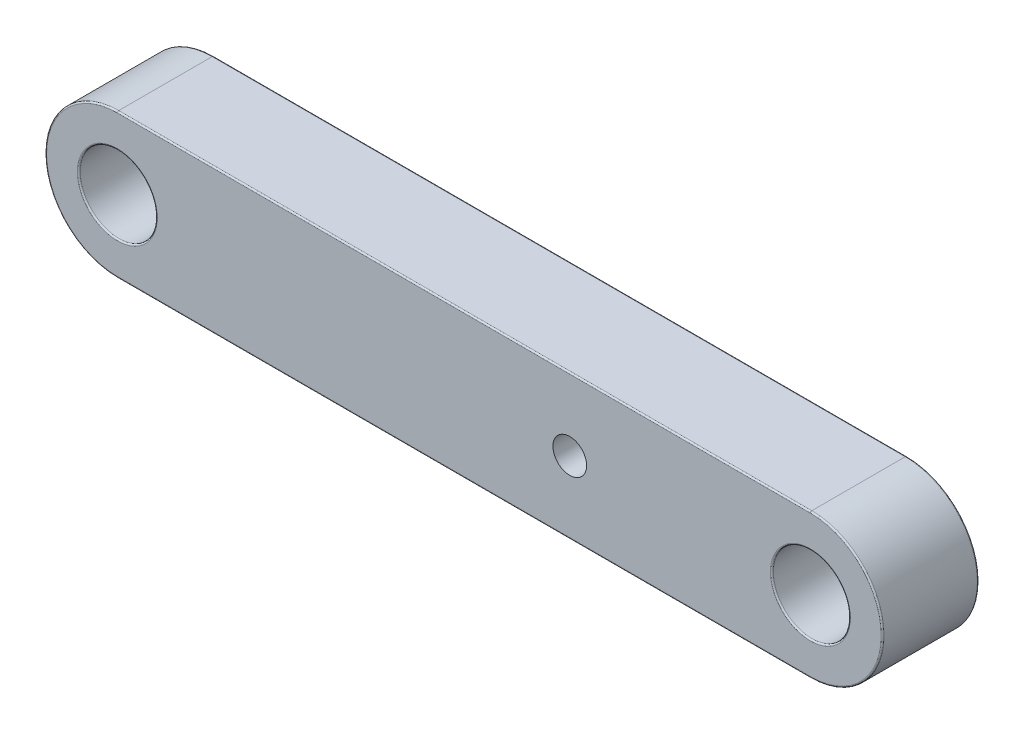
ISO-10303-21;
HEADER;
FILE_DESCRIPTION(('STEP AP214'),'2;1');
FILE_NAME('part.step','',(''),(''),'','','');
FILE_SCHEMA(('AUTOMOTIVE_DESIGN { 1 0 10303 214 1 1 1 1 }'));
ENDSEC;
DATA;
#1=APPLICATION_CONTEXT('core data for automotive mechanical design processes');
#2=APPLICATION_PROTOCOL_DEFINITION('international standard','automotive_design',2000,#1);
#3=PRODUCT_CONTEXT('',#1,'mechanical');
#4=PRODUCT('Part','Part','',(#3));
#5=PRODUCT_RELATED_PRODUCT_CATEGORY('part','',(#4));
#6=PRODUCT_DEFINITION_FORMATION('','',#4);
#7=PRODUCT_DEFINITION_CONTEXT('part definition',#1,'design');
#8=PRODUCT_DEFINITION('design','',#6,#7);
#9=PRODUCT_DEFINITION_SHAPE('','',#8);
#10=(LENGTH_UNIT() NAMED_UNIT(*) SI_UNIT(.MILLI.,.METRE.));
#11=(NAMED_UNIT(*) PLANE_ANGLE_UNIT() SI_UNIT($,.RADIAN.));
#12=(NAMED_UNIT(*) SI_UNIT($,.STERADIAN.) SOLID_ANGLE_UNIT());
#13=UNCERTAINTY_MEASURE_WITH_UNIT(LENGTH_MEASURE(1.E-05),#10,'distance_accuracy_value','');
#14=(GEOMETRIC_REPRESENTATION_CONTEXT(3) GLOBAL_UNCERTAINTY_ASSIGNED_CONTEXT((#13)) GLOBAL_UNIT_ASSIGNED_CONTEXT((#10,
#11,#12)) REPRESENTATION_CONTEXT('',''));
#15=CARTESIAN_POINT('',(0.,0.,0.));
#16=DIRECTION('',(0.,0.,1.));
#17=DIRECTION('',(1.,0.,0.));
#18=AXIS2_PLACEMENT_3D('',#15,#16,#17);
#19=CARTESIAN_POINT('',(36.,0.,5.));
#20=DIRECTION('',(0.,0.,1.));
#21=DIRECTION('',(1.,0.,0.));
#22=AXIS2_PLACEMENT_3D('',#19,#20,#21);
#23=PLANE('',#22);
#24=CARTESIAN_POINT('',(11.,0.000299999999999276,5.));
#25=DIRECTION('',(0.,0.,-1.));
#26=DIRECTION('',(-1.,0.,0.));
#27=AXIS2_PLACEMENT_3D('',#24,#25,#26);
#28=CIRCLE('',#27,1.75);
#29=CARTESIAN_POINT('',(9.25,0.000299999999999276,5.));
#30=VERTEX_POINT('',#29);
#31=EDGE_CURVE('E182',#30,#30,#28,.T.);
#32=ORIENTED_EDGE('',*,*,#31,.T.);
#33=EDGE_LOOP('',(#32));
#34=FACE_BOUND('',#33,.T.);
#35=CARTESIAN_POINT('',(36.,0.,5.));
#36=DIRECTION('',(0.,0.,1.));
#37=DIRECTION('',(1.,0.,0.));
#38=AXIS2_PLACEMENT_3D('',#35,#36,#37);
#39=CIRCLE('',#38,4.15);
#40=CARTESIAN_POINT('',(40.15,0.,5.));
#41=VERTEX_POINT('',#40);
#42=EDGE_CURVE('E11',#41,#41,#39,.F.);
#43=ORIENTED_EDGE('',*,*,#42,.T.);
#44=EDGE_LOOP('',(#43));
#45=FACE_BOUND('',#44,.T.);
#46=CARTESIAN_POINT('',(-36.,0.,5.));
#47=DIRECTION('',(0.,0.,1.));
#48=DIRECTION('',(1.,0.,0.));
#49=AXIS2_PLACEMENT_3D('',#46,#47,#48);
#50=CIRCLE('',#49,7.35000000000009);
#51=CARTESIAN_POINT('',(-35.9999988682833,7.35,5.));
#52=VERTEX_POINT('',#51);
#53=CARTESIAN_POINT('',(-35.9999988452009,-7.35,5.));
#54=VERTEX_POINT('',#53);
#55=EDGE_CURVE('E75',#52,#54,#50,.T.);
#56=ORIENTED_EDGE('',*,*,#55,.T.);
#57=DIRECTION('',(1.,0.,0.));
#58=VECTOR('',#57,1.);
#59=CARTESIAN_POINT('',(35.9999988451871,-7.35,5.));
#60=LINE('',#59,#58);
#61=CARTESIAN_POINT('',(35.9999988451871,-7.35,5.));
#62=VERTEX_POINT('',#61);
#63=EDGE_CURVE('E59',#54,#62,#60,.T.);
#64=ORIENTED_EDGE('',*,*,#63,.T.);
#65=CARTESIAN_POINT('',(36.,0.,5.));
#66=DIRECTION('',(0.,0.,1.));
#67=DIRECTION('',(1.,0.,0.));
#68=AXIS2_PLACEMENT_3D('',#65,#66,#67);
#69=CIRCLE('',#68,7.35000000000009);
#70=CARTESIAN_POINT('',(35.9999988452009,7.35,5.));
#71=VERTEX_POINT('',#70);
#72=EDGE_CURVE('E281',#62,#71,#69,.T.);
#73=ORIENTED_EDGE('',*,*,#72,.T.);
#74=DIRECTION('',(-1.,0.,0.));
#75=VECTOR('',#74,1.);
#76=CARTESIAN_POINT('',(-35.999998845187,7.35,5.));
#77=LINE('',#76,#75);
#78=EDGE_CURVE('E284',#71,#52,#77,.T.);
#79=ORIENTED_EDGE('',*,*,#78,.T.);
#80=EDGE_LOOP('',(#56,#64,#73,#79));
#81=FACE_BOUND('',#80,.T.);
#82=CARTESIAN_POINT('',(-36.,0.,5.));
#83=DIRECTION('',(0.,0.,1.));
#84=DIRECTION('',(1.,0.,0.));
#85=AXIS2_PLACEMENT_3D('',#82,#83,#84);
#86=CIRCLE('',#85,4.15);
#87=CARTESIAN_POINT('',(-31.85,0.,5.));
#88=VERTEX_POINT('',#87);
#89=EDGE_CURVE('E277',#88,#88,#86,.F.);
#90=ORIENTED_EDGE('',*,*,#89,.T.);
#91=EDGE_LOOP('',(#90));
#92=FACE_BOUND('',#91,.T.);
#93=ADVANCED_FACE('F49',(#34,#45,#81,#92),#23,.T.);
#94=CARTESIAN_POINT('',(36.,0.,-5.));
#95=DIRECTION('',(0.,0.,1.));
#96=DIRECTION('',(1.,0.,0.));
#97=AXIS2_PLACEMENT_3D('',#94,#95,#96);
#98=PLANE('',#97);
#99=DIRECTION('',(-1.,0.,0.));
#100=VECTOR('',#99,1.);
#101=CARTESIAN_POINT('',(16.,-3.9994,-5.));
#102=LINE('',#101,#100);
#103=CARTESIAN_POINT('',(16.,-3.9994,-5.));
#104=VERTEX_POINT('',#103);
#105=CARTESIAN_POINT('',(6.,-3.9994,-5.));
#106=VERTEX_POINT('',#105);
#107=EDGE_CURVE('E181',#104,#106,#102,.T.);
#108=ORIENTED_EDGE('',*,*,#107,.F.);
#109=DIRECTION('',(0.,-1.,0.));
#110=VECTOR('',#109,1.);
#111=CARTESIAN_POINT('',(16.,4.,-5.));
#112=LINE('',#111,#110);
#113=CARTESIAN_POINT('',(16.,4.,-5.));
#114=VERTEX_POINT('',#113);
#115=EDGE_CURVE('E67',#114,#104,#112,.T.);
#116=ORIENTED_EDGE('',*,*,#115,.F.);
#117=DIRECTION('',(1.,0.,0.));
#118=VECTOR('',#117,1.);
#119=CARTESIAN_POINT('',(16.,4.,-5.));
#120=LINE('',#119,#118);
#121=CARTESIAN_POINT('',(6.,4.,-5.));
#122=VERTEX_POINT('',#121);
#123=EDGE_CURVE('E165',#122,#114,#120,.T.);
#124=ORIENTED_EDGE('',*,*,#123,.F.);
#125=DIRECTION('',(0.,1.,0.));
#126=VECTOR('',#125,1.);
#127=CARTESIAN_POINT('',(6.,4.,-5.));
#128=LINE('',#127,#126);
#129=EDGE_CURVE('E169',#106,#122,#128,.T.);
#130=ORIENTED_EDGE('',*,*,#129,.F.);
#131=EDGE_LOOP('',(#108,#116,#124,#130));
#132=FACE_BOUND('',#131,.T.);
#133=CARTESIAN_POINT('',(36.,0.,-5.));
#134=DIRECTION('',(0.,0.,1.));
#135=DIRECTION('',(1.,0.,0.));
#136=AXIS2_PLACEMENT_3D('',#133,#134,#135);
#137=CIRCLE('',#136,4.15);
#138=CARTESIAN_POINT('',(40.15,0.,-5.));
#139=VERTEX_POINT('',#138);
#140=EDGE_CURVE('E231',#139,#139,#137,.T.);
#141=ORIENTED_EDGE('',*,*,#140,.T.);
#142=EDGE_LOOP('',(#141));
#143=FACE_BOUND('',#142,.T.);
#144=CARTESIAN_POINT('',(-36.,0.,-5.));
#145=DIRECTION('',(0.,0.,1.));
#146=DIRECTION('',(1.,0.,0.));
#147=AXIS2_PLACEMENT_3D('',#144,#145,#146);
#148=CIRCLE('',#147,4.15);
#149=CARTESIAN_POINT('',(-31.85,0.,-5.));
#150=VERTEX_POINT('',#149);
#151=EDGE_CURVE('E227',#150,#150,#148,.T.);
#152=ORIENTED_EDGE('',*,*,#151,.T.);
#153=EDGE_LOOP('',(#152));
#154=FACE_BOUND('',#153,.T.);
#155=CARTESIAN_POINT('',(-36.,0.,-5.));
#156=DIRECTION('',(0.,0.,1.));
#157=DIRECTION('',(1.,0.,0.));
#158=AXIS2_PLACEMENT_3D('',#155,#156,#157);
#159=CIRCLE('',#158,7.35000000000009);
#160=CARTESIAN_POINT('',(-35.9999988682969,-7.35,-5.));
#161=VERTEX_POINT('',#160);
#162=CARTESIAN_POINT('',(-35.9999988451871,7.35,-5.));
#163=VERTEX_POINT('',#162);
#164=EDGE_CURVE('E220',#161,#163,#159,.F.);
#165=ORIENTED_EDGE('',*,*,#164,.T.);
#166=DIRECTION('',(-1.,0.,0.));
#167=VECTOR('',#166,1.);
#168=CARTESIAN_POINT('',(36.,7.35,-5.));
#169=LINE('',#168,#167);
#170=CARTESIAN_POINT('',(35.9999988452009,7.35,-5.));
#171=VERTEX_POINT('',#170);
#172=EDGE_CURVE('E223',#163,#171,#169,.F.);
#173=ORIENTED_EDGE('',*,*,#172,.T.);
#174=CARTESIAN_POINT('',(36.,0.,-5.));
#175=DIRECTION('',(0.,0.,1.));
#176=DIRECTION('',(1.,0.,0.));
#177=AXIS2_PLACEMENT_3D('',#174,#175,#176);
#178=CIRCLE('',#177,7.35000000000009);
#179=CARTESIAN_POINT('',(35.9999988451871,-7.35,-5.));
#180=VERTEX_POINT('',#179);
#181=EDGE_CURVE('E214',#171,#180,#178,.F.);
#182=ORIENTED_EDGE('',*,*,#181,.T.);
#183=DIRECTION('',(1.,0.,0.));
#184=VECTOR('',#183,1.);
#185=CARTESIAN_POINT('',(36.,-7.35,-5.));
#186=LINE('',#185,#184);
#187=EDGE_CURVE('E217',#180,#161,#186,.F.);
#188=ORIENTED_EDGE('',*,*,#187,.T.);
#189=EDGE_LOOP('',(#165,#173,#182,#188));
#190=FACE_BOUND('',#189,.T.);
#191=ADVANCED_FACE('F359',(#132,#143,#154,#190),#98,.F.);
#192=CARTESIAN_POINT('',(36.,0.,5.));
#193=DIRECTION('',(0.,0.,-1.));
#194=DIRECTION('',(-1.,0.,0.));
#195=AXIS2_PLACEMENT_3D('',#192,#193,#194);
#196=CYLINDRICAL_SURFACE('',#195,7.50000000000009);
#197=DIRECTION('',(0.,0.,-1.));
#198=VECTOR('',#197,1.);
#199=CARTESIAN_POINT('',(35.9999988451871,-7.5,5.));
#200=LINE('',#199,#198);
#201=CARTESIAN_POINT('',(35.9999988451871,-7.5,4.85));
#202=VERTEX_POINT('',#201);
#203=CARTESIAN_POINT('',(35.9999988451871,-7.5,-4.85));
#204=VERTEX_POINT('',#203);
#205=EDGE_CURVE('E197',#202,#204,#200,.T.);
#206=ORIENTED_EDGE('',*,*,#205,.T.);
#207=CARTESIAN_POINT('',(36.,0.,-4.85));
#208=DIRECTION('',(0.,0.,1.));
#209=DIRECTION('',(1.,0.,0.));
#210=AXIS2_PLACEMENT_3D('',#207,#208,#209);
#211=CIRCLE('',#210,7.50000000000009);
#212=CARTESIAN_POINT('',(35.9999988452009,7.5,-4.85));
#213=VERTEX_POINT('',#212);
#214=EDGE_CURVE('E274',#204,#213,#211,.T.);
#215=ORIENTED_EDGE('',*,*,#214,.T.);
#216=DIRECTION('',(0.,0.,-1.));
#217=VECTOR('',#216,1.);
#218=CARTESIAN_POINT('',(35.9999988452009,7.5,5.));
#219=LINE('',#218,#217);
#220=CARTESIAN_POINT('',(35.9999988452009,7.5,4.85));
#221=VERTEX_POINT('',#220);
#222=EDGE_CURVE('E210',#221,#213,#219,.T.);
#223=ORIENTED_EDGE('',*,*,#222,.F.);
#224=CARTESIAN_POINT('',(36.,0.,4.85));
#225=DIRECTION('',(0.,0.,1.));
#226=DIRECTION('',(1.,0.,0.));
#227=AXIS2_PLACEMENT_3D('',#224,#225,#226);
#228=CIRCLE('',#227,7.50000000000009);
#229=EDGE_CURVE('E271',#221,#202,#228,.F.);
#230=ORIENTED_EDGE('',*,*,#229,.T.);
#231=EDGE_LOOP('',(#206,#215,#223,#230));
#232=FACE_BOUND('',#231,.T.);
#233=ADVANCED_FACE('F331',(#232),#196,.T.);
#234=CARTESIAN_POINT('',(-35.9999988451871,7.5,5.));
#235=DIRECTION('',(0.,-1.,0.));
#236=DIRECTION('',(0.,0.,-1.));
#237=AXIS2_PLACEMENT_3D('',#234,#235,#236);
#238=PLANE('',#237);
#239=ORIENTED_EDGE('',*,*,#222,.T.);
#240=DIRECTION('',(-1.,0.,0.));
#241=VECTOR('',#240,1.);
#242=CARTESIAN_POINT('',(-35.9999988451871,7.5,-4.85));
#243=LINE('',#242,#241);
#244=CARTESIAN_POINT('',(-35.9999988451871,7.5,-4.85));
#245=VERTEX_POINT('',#244);
#246=EDGE_CURVE('E254',#213,#245,#243,.T.);
#247=ORIENTED_EDGE('',*,*,#246,.T.);
#248=DIRECTION('',(0.,0.,-1.));
#249=VECTOR('',#248,1.);
#250=CARTESIAN_POINT('',(-35.9999988451871,7.5,5.));
#251=LINE('',#250,#249);
#252=CARTESIAN_POINT('',(-35.9999988451871,7.5,4.85));
#253=VERTEX_POINT('',#252);
#254=EDGE_CURVE('E206',#253,#245,#251,.T.);
#255=ORIENTED_EDGE('',*,*,#254,.F.);
#256=DIRECTION('',(-1.,0.,0.));
#257=VECTOR('',#256,1.);
#258=CARTESIAN_POINT('',(35.9999988452009,7.5,4.85));
#259=LINE('',#258,#257);
#260=EDGE_CURVE('E251',#253,#221,#259,.F.);
#261=ORIENTED_EDGE('',*,*,#260,.T.);
#262=EDGE_LOOP('',(#239,#247,#255,#261));
#263=FACE_BOUND('',#262,.T.);
#264=ADVANCED_FACE('F328',(#263),#238,.F.);
#265=CARTESIAN_POINT('',(-36.,0.,5.));
#266=DIRECTION('',(0.,0.,-1.));
#267=DIRECTION('',(-1.,0.,0.));
#268=AXIS2_PLACEMENT_3D('',#265,#266,#267);
#269=CYLINDRICAL_SURFACE('',#268,7.50000000000009);
#270=ORIENTED_EDGE('',*,*,#254,.T.);
#271=CARTESIAN_POINT('',(-36.,0.,-4.85));
#272=DIRECTION('',(0.,0.,1.));
#273=DIRECTION('',(1.,0.,0.));
#274=AXIS2_PLACEMENT_3D('',#271,#272,#273);
#275=CIRCLE('',#274,7.50000000000009);
#276=CARTESIAN_POINT('',(-35.9999988452009,-7.5,-4.85));
#277=VERTEX_POINT('',#276);
#278=EDGE_CURVE('E261',#245,#277,#275,.T.);
#279=ORIENTED_EDGE('',*,*,#278,.T.);
#280=DIRECTION('',(0.,0.,-1.));
#281=VECTOR('',#280,1.);
#282=CARTESIAN_POINT('',(-35.9999988452009,-7.5,5.));
#283=LINE('',#282,#281);
#284=CARTESIAN_POINT('',(-35.9999988452009,-7.5,4.85));
#285=VERTEX_POINT('',#284);
#286=EDGE_CURVE('E201',#285,#277,#283,.T.);
#287=ORIENTED_EDGE('',*,*,#286,.F.);
#288=CARTESIAN_POINT('',(-36.,0.,4.85));
#289=DIRECTION('',(0.,0.,1.));
#290=DIRECTION('',(1.,0.,0.));
#291=AXIS2_PLACEMENT_3D('',#288,#289,#290);
#292=CIRCLE('',#291,7.50000000000009);
#293=EDGE_CURVE('E258',#285,#253,#292,.F.);
#294=ORIENTED_EDGE('',*,*,#293,.T.);
#295=EDGE_LOOP('',(#270,#279,#287,#294));
#296=FACE_BOUND('',#295,.T.);
#297=ADVANCED_FACE('F345',(#296),#269,.T.);
#298=CARTESIAN_POINT('',(-35.9999988452009,-7.5,5.));
#299=DIRECTION('',(0.,1.,0.));
#300=DIRECTION('',(0.,0.,1.));
#301=AXIS2_PLACEMENT_3D('',#298,#299,#300);
#302=PLANE('',#301);
#303=ORIENTED_EDGE('',*,*,#286,.T.);
#304=DIRECTION('',(1.,0.,0.));
#305=VECTOR('',#304,1.);
#306=CARTESIAN_POINT('',(-35.9999988452009,-7.5,-4.85));
#307=LINE('',#306,#305);
#308=EDGE_CURVE('E268',#277,#204,#307,.T.);
#309=ORIENTED_EDGE('',*,*,#308,.T.);
#310=ORIENTED_EDGE('',*,*,#205,.F.);
#311=DIRECTION('',(1.,0.,0.));
#312=VECTOR('',#311,1.);
#313=CARTESIAN_POINT('',(-35.9999988452009,-7.5,4.85));
#314=LINE('',#313,#312);
#315=EDGE_CURVE('E264',#202,#285,#314,.F.);
#316=ORIENTED_EDGE('',*,*,#315,.T.);
#317=EDGE_LOOP('',(#303,#309,#310,#316));
#318=FACE_BOUND('',#317,.T.);
#319=ADVANCED_FACE('F349',(#318),#302,.F.);
#320=CARTESIAN_POINT('',(-36.,0.,5.));
#321=DIRECTION('',(0.,0.,-1.));
#322=DIRECTION('',(-1.,0.,0.));
#323=AXIS2_PLACEMENT_3D('',#320,#321,#322);
#324=CYLINDRICAL_SURFACE('',#323,4.);
#325=CARTESIAN_POINT('',(-36.,0.,-4.85));
#326=DIRECTION('',(0.,0.,1.));
#327=DIRECTION('',(1.,0.,0.));
#328=AXIS2_PLACEMENT_3D('',#325,#326,#327);
#329=CIRCLE('',#328,4.);
#330=CARTESIAN_POINT('',(-32.,0.,-4.85));
#331=VERTEX_POINT('',#330);
#332=EDGE_CURVE('E247',#331,#331,#329,.F.);
#333=ORIENTED_EDGE('',*,*,#332,.T.);
#334=EDGE_LOOP('',(#333));
#335=FACE_BOUND('',#334,.T.);
#336=CARTESIAN_POINT('',(-36.,0.,4.85));
#337=DIRECTION('',(0.,0.,1.));
#338=DIRECTION('',(1.,0.,0.));
#339=AXIS2_PLACEMENT_3D('',#336,#337,#338);
#340=CIRCLE('',#339,4.);
#341=CARTESIAN_POINT('',(-32.,0.,4.85));
#342=VERTEX_POINT('',#341);
#343=EDGE_CURVE('E243',#342,#342,#340,.T.);
#344=ORIENTED_EDGE('',*,*,#343,.T.);
#345=EDGE_LOOP('',(#344));
#346=FACE_BOUND('',#345,.T.);
#347=ADVANCED_FACE('F375',(#335,#346),#324,.F.);
#348=CARTESIAN_POINT('',(36.,0.,5.));
#349=DIRECTION('',(0.,0.,-1.));
#350=DIRECTION('',(-1.,0.,0.));
#351=AXIS2_PLACEMENT_3D('',#348,#349,#350);
#352=CYLINDRICAL_SURFACE('',#351,4.);
#353=CARTESIAN_POINT('',(36.,0.,-4.85));
#354=DIRECTION('',(0.,0.,1.));
#355=DIRECTION('',(1.,0.,0.));
#356=AXIS2_PLACEMENT_3D('',#353,#354,#355);
#357=CIRCLE('',#356,4.);
#358=CARTESIAN_POINT('',(40.,0.,-4.85));
#359=VERTEX_POINT('',#358);
#360=EDGE_CURVE('E239',#359,#359,#357,.F.);
#361=ORIENTED_EDGE('',*,*,#360,.T.);
#362=EDGE_LOOP('',(#361));
#363=FACE_BOUND('',#362,.T.);
#364=CARTESIAN_POINT('',(36.,0.,4.85));
#365=DIRECTION('',(0.,0.,1.));
#366=DIRECTION('',(1.,0.,0.));
#367=AXIS2_PLACEMENT_3D('',#364,#365,#366);
#368=CIRCLE('',#367,4.);
#369=CARTESIAN_POINT('',(40.,0.,4.85));
#370=VERTEX_POINT('',#369);
#371=EDGE_CURVE('E235',#370,#370,#368,.T.);
#372=ORIENTED_EDGE('',*,*,#371,.T.);
#373=EDGE_LOOP('',(#372));
#374=FACE_BOUND('',#373,.T.);
#375=ADVANCED_FACE('F384',(#363,#374),#352,.F.);
#376=CARTESIAN_POINT('',(36.,0.,-4.85));
#377=DIRECTION('',(0.,0.,1.));
#378=DIRECTION('',(1.,0.,0.));
#379=AXIS2_PLACEMENT_3D('',#376,#377,#378);
#380=TOROIDAL_SURFACE('',#379,4.15,0.15);
#381=ORIENTED_EDGE('',*,*,#360,.F.);
#382=EDGE_LOOP('',(#381));
#383=FACE_BOUND('',#382,.T.);
#384=ORIENTED_EDGE('',*,*,#140,.F.);
#385=EDGE_LOOP('',(#384));
#386=FACE_BOUND('',#385,.T.);
#387=ADVANCED_FACE('F380',(#383,#386),#380,.T.);
#388=CARTESIAN_POINT('',(-36.,0.,-4.85));
#389=DIRECTION('',(0.,0.,1.));
#390=DIRECTION('',(1.,0.,0.));
#391=AXIS2_PLACEMENT_3D('',#388,#389,#390);
#392=TOROIDAL_SURFACE('',#391,4.15,0.15);
#393=ORIENTED_EDGE('',*,*,#332,.F.);
#394=EDGE_LOOP('',(#393));
#395=FACE_BOUND('',#394,.T.);
#396=ORIENTED_EDGE('',*,*,#151,.F.);
#397=EDGE_LOOP('',(#396));
#398=FACE_BOUND('',#397,.T.);
#399=ADVANCED_FACE('F383',(#395,#398),#392,.T.);
#400=CARTESIAN_POINT('',(-35.9999988452009,-7.35,-4.85));
#401=DIRECTION('',(1.,0.,0.));
#402=DIRECTION('',(0.,0.,-1.));
#403=AXIS2_PLACEMENT_3D('',#400,#401,#402);
#404=CYLINDRICAL_SURFACE('',#403,0.15);
#405=CARTESIAN_POINT('',(-35.9999988682969,-7.35,-4.85));
#406=DIRECTION('',(-0.999999999999988,-1.53973223060431E-07,0.));
#407=DIRECTION('',(1.53973223060431E-07,-0.999999999999988,0.));
#408=AXIS2_PLACEMENT_3D('',#405,#406,#407);
#409=CIRCLE('',#408,0.15);
#410=EDGE_CURVE('E297',#161,#277,#409,.T.);
#411=ORIENTED_EDGE('',*,*,#410,.F.);
#412=ORIENTED_EDGE('',*,*,#187,.F.);
#413=CARTESIAN_POINT('',(35.9999988451871,-7.35,-4.85));
#414=DIRECTION('',(1.,0.,0.));
#415=DIRECTION('',(0.,0.,-1.));
#416=AXIS2_PLACEMENT_3D('',#413,#414,#415);
#417=CIRCLE('',#416,0.15);
#418=EDGE_CURVE('E202',#204,#180,#417,.T.);
#419=ORIENTED_EDGE('',*,*,#418,.F.);
#420=ORIENTED_EDGE('',*,*,#308,.F.);
#421=EDGE_LOOP('',(#411,#412,#419,#420));
#422=FACE_BOUND('',#421,.T.);
#423=ADVANCED_FACE('F353',(#422),#404,.T.);
#424=CARTESIAN_POINT('',(36.,0.,-4.85));
#425=DIRECTION('',(0.,0.,1.));
#426=DIRECTION('',(1.,0.,0.));
#427=AXIS2_PLACEMENT_3D('',#424,#425,#426);
#428=TOROIDAL_SURFACE('',#427,7.35000000000009,0.15);
#429=ORIENTED_EDGE('',*,*,#418,.T.);
#430=ORIENTED_EDGE('',*,*,#181,.F.);
#431=CARTESIAN_POINT('',(35.9999988682969,7.35,-4.85));
#432=DIRECTION('',(-0.999999999999976,-1.53973223060431E-07,1.53973223060434E-07));
#433=DIRECTION('',(1.53973223060436E-07,0.,0.999999999999988));
#434=AXIS2_PLACEMENT_3D('',#431,#432,#433);
#435=CIRCLE('',#434,0.15);
#436=EDGE_CURVE('E294',#213,#171,#435,.T.);
#437=ORIENTED_EDGE('',*,*,#436,.F.);
#438=ORIENTED_EDGE('',*,*,#214,.F.);
#439=EDGE_LOOP('',(#429,#430,#437,#438));
#440=FACE_BOUND('',#439,.T.);
#441=ADVANCED_FACE('F336',(#440),#428,.T.);
#442=CARTESIAN_POINT('',(-36.,0.,-4.85));
#443=DIRECTION('',(0.,0.,1.));
#444=DIRECTION('',(1.,0.,0.));
#445=AXIS2_PLACEMENT_3D('',#442,#443,#444);
#446=TOROIDAL_SURFACE('',#445,7.35000000000009,0.15);
#447=ORIENTED_EDGE('',*,*,#410,.T.);
#448=ORIENTED_EDGE('',*,*,#278,.F.);
#449=CARTESIAN_POINT('',(-35.9999988451871,7.35,-4.85));
#450=DIRECTION('',(1.,0.,0.));
#451=DIRECTION('',(0.,0.,-1.));
#452=AXIS2_PLACEMENT_3D('',#449,#450,#451);
#453=CIRCLE('',#452,0.15);
#454=EDGE_CURVE('E291',#163,#245,#453,.T.);
#455=ORIENTED_EDGE('',*,*,#454,.F.);
#456=ORIENTED_EDGE('',*,*,#164,.F.);
#457=EDGE_LOOP('',(#447,#448,#455,#456));
#458=FACE_BOUND('',#457,.T.);
#459=ADVANCED_FACE('F357',(#458),#446,.T.);
#460=CARTESIAN_POINT('',(-35.9999988451871,7.35,-4.85));
#461=DIRECTION('',(-1.,0.,0.));
#462=DIRECTION('',(0.,0.,1.));
#463=AXIS2_PLACEMENT_3D('',#460,#461,#462);
#464=CYLINDRICAL_SURFACE('',#463,0.15);
#465=ORIENTED_EDGE('',*,*,#436,.T.);
#466=ORIENTED_EDGE('',*,*,#172,.F.);
#467=ORIENTED_EDGE('',*,*,#454,.T.);
#468=ORIENTED_EDGE('',*,*,#246,.F.);
#469=EDGE_LOOP('',(#465,#466,#467,#468));
#470=FACE_BOUND('',#469,.T.);
#471=ADVANCED_FACE('F341',(#470),#464,.T.);
#472=CARTESIAN_POINT('',(36.,0.,4.85));
#473=DIRECTION('',(0.,0.,1.));
#474=DIRECTION('',(1.,0.,0.));
#475=AXIS2_PLACEMENT_3D('',#472,#473,#474);
#476=TOROIDAL_SURFACE('',#475,4.15,0.15);
#477=ORIENTED_EDGE('',*,*,#42,.F.);
#478=EDGE_LOOP('',(#477));
#479=FACE_BOUND('',#478,.T.);
#480=ORIENTED_EDGE('',*,*,#371,.F.);
#481=EDGE_LOOP('',(#480));
#482=FACE_BOUND('',#481,.T.);
#483=ADVANCED_FACE('F391',(#479,#482),#476,.T.);
#484=CARTESIAN_POINT('',(36.,7.35,4.85));
#485=DIRECTION('',(1.,0.,0.));
#486=DIRECTION('',(0.,0.,-1.));
#487=AXIS2_PLACEMENT_3D('',#484,#485,#486);
#488=CYLINDRICAL_SURFACE('',#487,0.15);
#489=CARTESIAN_POINT('',(35.9999988452009,7.35,4.85));
#490=DIRECTION('',(1.,0.,0.));
#491=DIRECTION('',(0.,0.,-1.));
#492=AXIS2_PLACEMENT_3D('',#489,#490,#491);
#493=CIRCLE('',#492,0.15);
#494=EDGE_CURVE('E308',#221,#71,#493,.T.);
#495=ORIENTED_EDGE('',*,*,#494,.F.);
#496=ORIENTED_EDGE('',*,*,#260,.F.);
#497=CARTESIAN_POINT('',(-35.9999988682833,7.35,4.85));
#498=DIRECTION('',(-0.999999999999988,1.53975073432139E-07,0.));
#499=DIRECTION('',(-1.53975073432139E-07,-0.999999999999988,0.));
#500=AXIS2_PLACEMENT_3D('',#497,#498,#499);
#501=CIRCLE('',#500,0.15);
#502=EDGE_CURVE('E53',#52,#253,#501,.T.);
#503=ORIENTED_EDGE('',*,*,#502,.F.);
#504=ORIENTED_EDGE('',*,*,#78,.F.);
#505=EDGE_LOOP('',(#495,#496,#503,#504));
#506=FACE_BOUND('',#505,.T.);
#507=ADVANCED_FACE('F324',(#506),#488,.T.);
#508=CARTESIAN_POINT('',(-36.,0.,4.85));
#509=DIRECTION('',(0.,0.,1.));
#510=DIRECTION('',(1.,0.,0.));
#511=AXIS2_PLACEMENT_3D('',#508,#509,#510);
#512=TOROIDAL_SURFACE('',#511,7.35000000000009,0.15);
#513=ORIENTED_EDGE('',*,*,#502,.T.);
#514=ORIENTED_EDGE('',*,*,#293,.F.);
#515=CARTESIAN_POINT('',(-35.9999988452009,-7.35,4.85));
#516=DIRECTION('',(1.,0.,0.));
#517=DIRECTION('',(0.,0.,-1.));
#518=AXIS2_PLACEMENT_3D('',#515,#516,#517);
#519=CIRCLE('',#518,0.15);
#520=EDGE_CURVE('E306',#54,#285,#519,.T.);
#521=ORIENTED_EDGE('',*,*,#520,.F.);
#522=ORIENTED_EDGE('',*,*,#55,.F.);
#523=EDGE_LOOP('',(#513,#514,#521,#522));
#524=FACE_BOUND('',#523,.T.);
#525=ADVANCED_FACE('F320',(#524),#512,.T.);
#526=CARTESIAN_POINT('',(36.,0.,4.85));
#527=DIRECTION('',(0.,0.,1.));
#528=DIRECTION('',(1.,0.,0.));
#529=AXIS2_PLACEMENT_3D('',#526,#527,#528);
#530=TOROIDAL_SURFACE('',#529,7.35000000000009,0.15);
#531=ORIENTED_EDGE('',*,*,#494,.T.);
#532=ORIENTED_EDGE('',*,*,#72,.F.);
#533=CARTESIAN_POINT('',(35.9999988682833,-7.35,4.85));
#534=DIRECTION('',(-0.999999999999976,1.53975073432139E-07,-1.5397507343214E-07));
#535=DIRECTION('',(-1.53975073432142E-07,0.,0.999999999999988));
#536=AXIS2_PLACEMENT_3D('',#533,#534,#535);
#537=CIRCLE('',#536,0.15);
#538=EDGE_CURVE('E191',#202,#62,#537,.T.);
#539=ORIENTED_EDGE('',*,*,#538,.F.);
#540=ORIENTED_EDGE('',*,*,#229,.F.);
#541=EDGE_LOOP('',(#531,#532,#539,#540));
#542=FACE_BOUND('',#541,.T.);
#543=ADVANCED_FACE('F404',(#542),#530,.T.);
#544=CARTESIAN_POINT('',(36.,-7.35,4.85));
#545=DIRECTION('',(-1.,0.,0.));
#546=DIRECTION('',(0.,0.,1.));
#547=AXIS2_PLACEMENT_3D('',#544,#545,#546);
#548=CYLINDRICAL_SURFACE('',#547,0.15);
#549=ORIENTED_EDGE('',*,*,#520,.T.);
#550=ORIENTED_EDGE('',*,*,#315,.F.);
#551=ORIENTED_EDGE('',*,*,#538,.T.);
#552=ORIENTED_EDGE('',*,*,#63,.F.);
#553=EDGE_LOOP('',(#549,#550,#551,#552));
#554=FACE_BOUND('',#553,.T.);
#555=ADVANCED_FACE('F401',(#554),#548,.T.);
#556=CARTESIAN_POINT('',(-36.,0.,4.85));
#557=DIRECTION('',(0.,0.,1.));
#558=DIRECTION('',(1.,0.,0.));
#559=AXIS2_PLACEMENT_3D('',#556,#557,#558);
#560=TOROIDAL_SURFACE('',#559,4.15,0.15);
#561=ORIENTED_EDGE('',*,*,#89,.F.);
#562=EDGE_LOOP('',(#561));
#563=FACE_BOUND('',#562,.T.);
#564=ORIENTED_EDGE('',*,*,#343,.F.);
#565=EDGE_LOOP('',(#564));
#566=FACE_BOUND('',#565,.T.);
#567=ADVANCED_FACE('F51',(#563,#566),#560,.T.);
#568=CARTESIAN_POINT('',(16.,4.,-2.));
#569=DIRECTION('',(1.,0.,0.));
#570=DIRECTION('',(0.,0.,-1.));
#571=AXIS2_PLACEMENT_3D('',#568,#569,#570);
#572=PLANE('',#571);
#573=ORIENTED_EDGE('',*,*,#115,.T.);
#574=DIRECTION('',(0.,0.,-1.));
#575=VECTOR('',#574,1.);
#576=CARTESIAN_POINT('',(16.,-3.9994,-2.));
#577=LINE('',#576,#575);
#578=CARTESIAN_POINT('',(16.,-3.9994,-2.));
#579=VERTEX_POINT('',#578);
#580=EDGE_CURVE('E140',#579,#104,#577,.T.);
#581=ORIENTED_EDGE('',*,*,#580,.F.);
#582=DIRECTION('',(0.,-1.,0.));
#583=VECTOR('',#582,1.);
#584=CARTESIAN_POINT('',(16.,4.,-2.));
#585=LINE('',#584,#583);
#586=CARTESIAN_POINT('',(16.,4.,-2.));
#587=VERTEX_POINT('',#586);
#588=EDGE_CURVE('E144',#587,#579,#585,.T.);
#589=ORIENTED_EDGE('',*,*,#588,.F.);
#590=DIRECTION('',(0.,0.,-1.));
#591=VECTOR('',#590,1.);
#592=CARTESIAN_POINT('',(16.,4.,-2.));
#593=LINE('',#592,#591);
#594=EDGE_CURVE('E188',#587,#114,#593,.T.);
#595=ORIENTED_EDGE('',*,*,#594,.T.);
#596=EDGE_LOOP('',(#573,#581,#589,#595));
#597=FACE_BOUND('',#596,.T.);
#598=ADVANCED_FACE('F142',(#597),#572,.F.);
#599=CARTESIAN_POINT('',(16.,4.,-2.));
#600=DIRECTION('',(0.,1.,0.));
#601=DIRECTION('',(0.,0.,1.));
#602=AXIS2_PLACEMENT_3D('',#599,#600,#601);
#603=PLANE('',#602);
#604=ORIENTED_EDGE('',*,*,#123,.T.);
#605=ORIENTED_EDGE('',*,*,#594,.F.);
#606=DIRECTION('',(1.,0.,0.));
#607=VECTOR('',#606,1.);
#608=CARTESIAN_POINT('',(16.,4.,-2.));
#609=LINE('',#608,#607);
#610=CARTESIAN_POINT('',(6.,4.,-2.));
#611=VERTEX_POINT('',#610);
#612=EDGE_CURVE('E151',#611,#587,#609,.T.);
#613=ORIENTED_EDGE('',*,*,#612,.F.);
#614=DIRECTION('',(0.,0.,-1.));
#615=VECTOR('',#614,1.);
#616=CARTESIAN_POINT('',(6.,4.,-2.));
#617=LINE('',#616,#615);
#618=EDGE_CURVE('E192',#611,#122,#617,.T.);
#619=ORIENTED_EDGE('',*,*,#618,.T.);
#620=EDGE_LOOP('',(#604,#605,#613,#619));
#621=FACE_BOUND('',#620,.T.);
#622=ADVANCED_FACE('F456',(#621),#603,.F.);
#623=CARTESIAN_POINT('',(6.,4.,-2.));
#624=DIRECTION('',(-1.,0.,0.));
#625=DIRECTION('',(0.,0.,1.));
#626=AXIS2_PLACEMENT_3D('',#623,#624,#625);
#627=PLANE('',#626);
#628=ORIENTED_EDGE('',*,*,#129,.T.);
#629=ORIENTED_EDGE('',*,*,#618,.F.);
#630=DIRECTION('',(0.,1.,0.));
#631=VECTOR('',#630,1.);
#632=CARTESIAN_POINT('',(6.,4.,-2.));
#633=LINE('',#632,#631);
#634=CARTESIAN_POINT('',(6.,-3.9994,-2.));
#635=VERTEX_POINT('',#634);
#636=EDGE_CURVE('E160',#635,#611,#633,.T.);
#637=ORIENTED_EDGE('',*,*,#636,.F.);
#638=DIRECTION('',(0.,0.,-1.));
#639=VECTOR('',#638,1.);
#640=CARTESIAN_POINT('',(6.,-3.9994,-2.));
#641=LINE('',#640,#639);
#642=EDGE_CURVE('E150',#635,#106,#641,.T.);
#643=ORIENTED_EDGE('',*,*,#642,.T.);
#644=EDGE_LOOP('',(#628,#629,#637,#643));
#645=FACE_BOUND('',#644,.T.);
#646=ADVANCED_FACE('F464',(#645),#627,.F.);
#647=CARTESIAN_POINT('',(16.,-3.9994,-2.));
#648=DIRECTION('',(0.,-1.,0.));
#649=DIRECTION('',(0.,0.,-1.));
#650=AXIS2_PLACEMENT_3D('',#647,#648,#649);
#651=PLANE('',#650);
#652=ORIENTED_EDGE('',*,*,#107,.T.);
#653=ORIENTED_EDGE('',*,*,#642,.F.);
#654=DIRECTION('',(-1.,0.,0.));
#655=VECTOR('',#654,1.);
#656=CARTESIAN_POINT('',(16.,-3.9994,-2.));
#657=LINE('',#656,#655);
#658=EDGE_CURVE('E154',#579,#635,#657,.T.);
#659=ORIENTED_EDGE('',*,*,#658,.F.);
#660=ORIENTED_EDGE('',*,*,#580,.T.);
#661=EDGE_LOOP('',(#652,#653,#659,#660));
#662=FACE_BOUND('',#661,.T.);
#663=ADVANCED_FACE('F155',(#662),#651,.F.);
#664=CARTESIAN_POINT('',(0.,0.,-2.));
#665=DIRECTION('',(0.,0.,-1.));
#666=DIRECTION('',(-1.,0.,0.));
#667=AXIS2_PLACEMENT_3D('',#664,#665,#666);
#668=PLANE('',#667);
#669=CARTESIAN_POINT('',(11.,0.000299999999999276,-2.));
#670=DIRECTION('',(0.,0.,-1.));
#671=DIRECTION('',(-1.,0.,0.));
#672=AXIS2_PLACEMENT_3D('',#669,#670,#671);
#673=CIRCLE('',#672,1.75);
#674=CARTESIAN_POINT('',(9.25,0.000299999999999276,-2.));
#675=VERTEX_POINT('',#674);
#676=EDGE_CURVE('E172',#675,#675,#673,.T.);
#677=ORIENTED_EDGE('',*,*,#676,.F.);
#678=EDGE_LOOP('',(#677));
#679=FACE_BOUND('',#678,.T.);
#680=ORIENTED_EDGE('',*,*,#588,.T.);
#681=ORIENTED_EDGE('',*,*,#658,.T.);
#682=ORIENTED_EDGE('',*,*,#636,.T.);
#683=ORIENTED_EDGE('',*,*,#612,.T.);
#684=EDGE_LOOP('',(#680,#681,#682,#683));
#685=FACE_BOUND('',#684,.T.);
#686=ADVANCED_FACE('F162',(#679,#685),#668,.T.);
#687=CARTESIAN_POINT('',(11.,0.000299999999999276,5.));
#688=DIRECTION('',(0.,0.,-1.));
#689=DIRECTION('',(-1.,0.,0.));
#690=AXIS2_PLACEMENT_3D('',#687,#688,#689);
#691=CYLINDRICAL_SURFACE('',#690,1.75);
#692=ORIENTED_EDGE('',*,*,#31,.F.);
#693=EDGE_LOOP('',(#692));
#694=FACE_BOUND('',#693,.T.);
#695=ORIENTED_EDGE('',*,*,#676,.T.);
#696=EDGE_LOOP('',(#695));
#697=FACE_BOUND('',#696,.T.);
#698=ADVANCED_FACE('F494',(#694,#697),#691,.F.);
#699=CLOSED_SHELL('',(#93,#191,#233,#264,#297,#319,#347,#375,#387,#399,#423,#441,#459,#471,#483,
#507,#525,#543,#555,#567,#598,#622,#646,#663,#686,#698));
#700=MANIFOLD_SOLID_BREP('B2',#699);
#701=ADVANCED_BREP_SHAPE_REPRESENTATION('',(#18,#700),#14);
#702=SHAPE_DEFINITION_REPRESENTATION(#9,#701);
ENDSEC;
END-ISO-10303-21;
